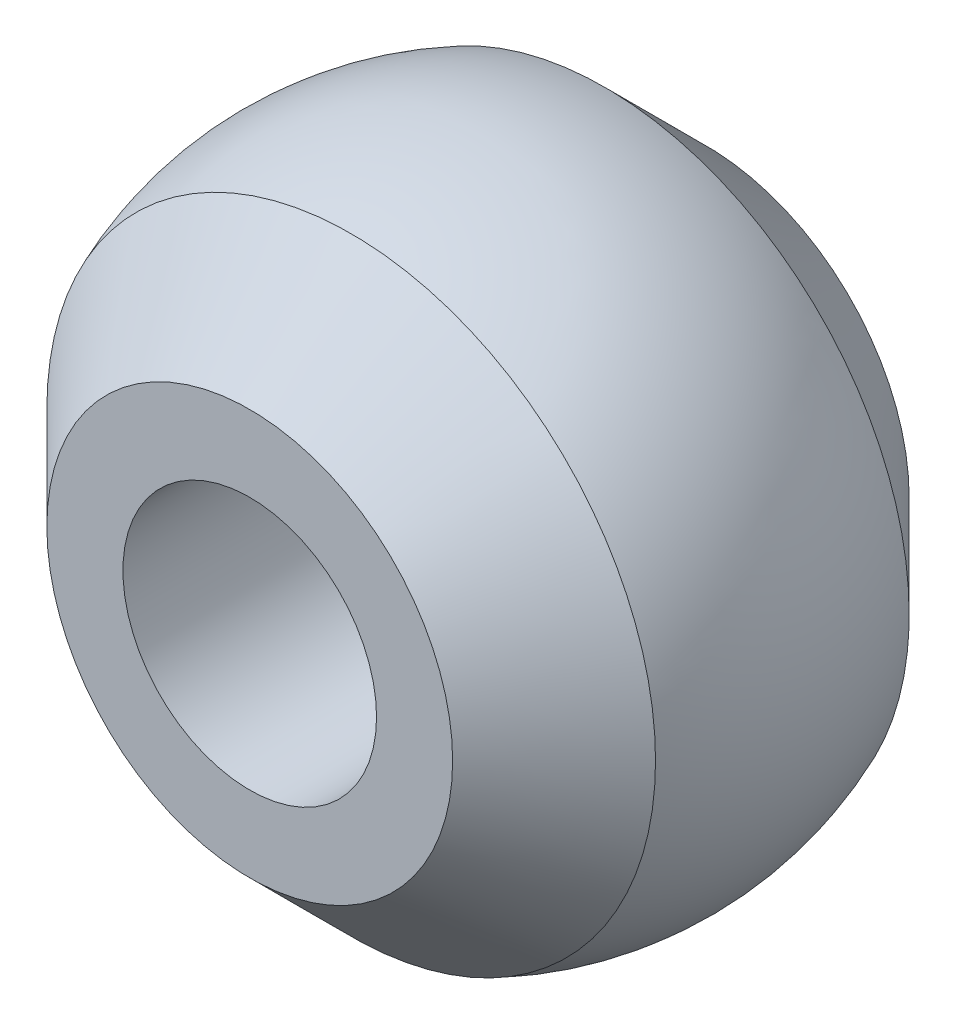
ISO-10303-21;
HEADER;
FILE_DESCRIPTION(('STEP AP214'),'2;1');
FILE_NAME('part.step','',(''),(''),'','','');
FILE_SCHEMA(('AUTOMOTIVE_DESIGN { 1 0 10303 214 1 1 1 1 }'));
ENDSEC;
DATA;
#1=APPLICATION_CONTEXT('core data for automotive mechanical design processes');
#2=APPLICATION_PROTOCOL_DEFINITION('international standard','automotive_design',2000,#1);
#3=PRODUCT_CONTEXT('',#1,'mechanical');
#4=PRODUCT('Part','Part','',(#3));
#5=PRODUCT_RELATED_PRODUCT_CATEGORY('part','',(#4));
#6=PRODUCT_DEFINITION_FORMATION('','',#4);
#7=PRODUCT_DEFINITION_CONTEXT('part definition',#1,'design');
#8=PRODUCT_DEFINITION('design','',#6,#7);
#9=PRODUCT_DEFINITION_SHAPE('','',#8);
#10=(LENGTH_UNIT() NAMED_UNIT(*) SI_UNIT(.MILLI.,.METRE.));
#11=(NAMED_UNIT(*) PLANE_ANGLE_UNIT() SI_UNIT($,.RADIAN.));
#12=(NAMED_UNIT(*) SI_UNIT($,.STERADIAN.) SOLID_ANGLE_UNIT());
#13=UNCERTAINTY_MEASURE_WITH_UNIT(LENGTH_MEASURE(1.E-05),#10,'distance_accuracy_value','');
#14=(GEOMETRIC_REPRESENTATION_CONTEXT(3) GLOBAL_UNCERTAINTY_ASSIGNED_CONTEXT((#13)) GLOBAL_UNIT_ASSIGNED_CONTEXT((#10,
#11,#12)) REPRESENTATION_CONTEXT('',''));
#15=CARTESIAN_POINT('',(0.,0.,0.));
#16=DIRECTION('',(0.,0.,1.));
#17=DIRECTION('',(1.,0.,0.));
#18=AXIS2_PLACEMENT_3D('',#15,#16,#17);
#19=CARTESIAN_POINT('',(0.,14.5,4.5));
#20=DIRECTION('',(0.,0.,1.));
#21=DIRECTION('',(1.,0.,0.));
#22=AXIS2_PLACEMENT_3D('',#19,#20,#21);
#23=PLANE('',#22);
#24=CARTESIAN_POINT('',(0.,14.5,4.5));
#25=DIRECTION('',(0.,0.,1.));
#26=DIRECTION('',(1.,0.,0.));
#27=AXIS2_PLACEMENT_3D('',#24,#25,#26);
#28=CIRCLE('',#27,2.5);
#29=CARTESIAN_POINT('',(2.5,14.5,4.5));
#30=VERTEX_POINT('',#29);
#31=EDGE_CURVE('E70',#30,#30,#28,.T.);
#32=ORIENTED_EDGE('',*,*,#31,.F.);
#33=EDGE_LOOP('',(#32));
#34=FACE_BOUND('',#33,.T.);
#35=CARTESIAN_POINT('',(0.,14.5,4.5));
#36=DIRECTION('',(0.,0.,1.));
#37=DIRECTION('',(1.,0.,0.));
#38=AXIS2_PLACEMENT_3D('',#35,#36,#37);
#39=CIRCLE('',#38,4.);
#40=CARTESIAN_POINT('',(4.,14.5,4.5));
#41=VERTEX_POINT('',#40);
#42=EDGE_CURVE('E11',#41,#41,#39,.T.);
#43=ORIENTED_EDGE('',*,*,#42,.T.);
#44=EDGE_LOOP('',(#43));
#45=FACE_BOUND('',#44,.T.);
#46=ADVANCED_FACE('F45',(#34,#45),#23,.T.);
#47=CARTESIAN_POINT('',(0.,14.5,4.5));
#48=DIRECTION('',(0.,0.,-1.));
#49=DIRECTION('',(-1.,0.,0.));
#50=AXIS2_PLACEMENT_3D('',#47,#48,#49);
#51=CONICAL_SURFACE('',#50,4.,0.785398163397448);
#52=ORIENTED_EDGE('',*,*,#42,.F.);
#53=EDGE_LOOP('',(#52));
#54=FACE_BOUND('',#53,.T.);
#55=CARTESIAN_POINT('',(0.,14.5,2.5));
#56=DIRECTION('',(0.,0.,1.));
#57=DIRECTION('',(1.,0.,0.));
#58=AXIS2_PLACEMENT_3D('',#55,#56,#57);
#59=CIRCLE('',#58,6.);
#60=CARTESIAN_POINT('',(6.,14.5,2.5));
#61=VERTEX_POINT('',#60);
#62=EDGE_CURVE('E78',#61,#61,#59,.T.);
#63=ORIENTED_EDGE('',*,*,#62,.T.);
#64=EDGE_LOOP('',(#63));
#65=FACE_BOUND('',#64,.T.);
#66=ADVANCED_FACE('F47',(#54,#65),#51,.T.);
#67=CARTESIAN_POINT('',(0.,14.5,-4.5));
#68=DIRECTION('',(0.,0.,-1.));
#69=DIRECTION('',(1.,0.,0.));
#70=AXIS2_PLACEMENT_3D('',#67,#68,#69);
#71=PLANE('',#70);
#72=CARTESIAN_POINT('',(0.,14.5,-4.5));
#73=DIRECTION('',(0.,0.,-1.));
#74=DIRECTION('',(-1.,0.,0.));
#75=AXIS2_PLACEMENT_3D('',#72,#73,#74);
#76=CIRCLE('',#75,2.5);
#77=CARTESIAN_POINT('',(-2.5,14.5,-4.5));
#78=VERTEX_POINT('',#77);
#79=EDGE_CURVE('E62',#78,#78,#76,.T.);
#80=ORIENTED_EDGE('',*,*,#79,.F.);
#81=EDGE_LOOP('',(#80));
#82=FACE_BOUND('',#81,.T.);
#83=CARTESIAN_POINT('',(0.,14.5,-4.5));
#84=DIRECTION('',(0.,0.,1.));
#85=DIRECTION('',(-1.,0.,0.));
#86=AXIS2_PLACEMENT_3D('',#83,#84,#85);
#87=CIRCLE('',#86,4.);
#88=CARTESIAN_POINT('',(-4.,14.5,-4.5));
#89=VERTEX_POINT('',#88);
#90=EDGE_CURVE('E56',#89,#89,#87,.T.);
#91=ORIENTED_EDGE('',*,*,#90,.F.);
#92=EDGE_LOOP('',(#91));
#93=FACE_BOUND('',#92,.T.);
#94=ADVANCED_FACE('F103',(#82,#93),#71,.T.);
#95=CARTESIAN_POINT('',(0.,14.5,-4.5));
#96=DIRECTION('',(0.,0.,1.));
#97=DIRECTION('',(-1.,0.,0.));
#98=AXIS2_PLACEMENT_3D('',#95,#96,#97);
#99=CONICAL_SURFACE('',#98,4.,0.785398163397448);
#100=ORIENTED_EDGE('',*,*,#90,.T.);
#101=EDGE_LOOP('',(#100));
#102=FACE_BOUND('',#101,.T.);
#103=CARTESIAN_POINT('',(6.,14.5,-2.5));
#104=CARTESIAN_POINT('',(6.00000208253265,14.5981748695653,-2.5));
#105=CARTESIAN_POINT('',(5.99759050275092,14.6963495619276,-2.5));
#106=CARTESIAN_POINT('',(5.98795497171115,14.8924625300015,-2.5));
#107=CARTESIAN_POINT('',(5.98073102045312,14.9904008057131,-2.5));
#108=CARTESIAN_POINT('',(5.96148569961324,15.1858048782416,-2.5));
#109=CARTESIAN_POINT('',(5.94946433003139,15.2832706750584,-2.5));
#110=CARTESIAN_POINT('',(5.92065378954598,15.4774950184059,-2.5));
#111=CARTESIAN_POINT('',(5.90386461864243,15.5742535649366,-2.5));
#112=CARTESIAN_POINT('',(5.86555874619633,15.7668302992569,-2.5));
#113=CARTESIAN_POINT('',(5.84404204465378,15.8626484870464,-2.5));
#114=CARTESIAN_POINT('',(5.79633299368075,16.0531136717927,-2.5));
#115=CARTESIAN_POINT('',(5.77014064425027,16.1477606687495,-2.5));
#116=CARTESIAN_POINT('',(5.71314338453624,16.3356554583041,-2.5));
#117=CARTESIAN_POINT('',(5.68233847425269,16.4289032509019,-2.5));
#118=CARTESIAN_POINT('',(5.61619030794355,16.6137749898048,-2.5));
#119=CARTESIAN_POINT('',(5.58084705191796,16.70539893611,-2.5));
#120=CARTESIAN_POINT('',(5.50570733821748,16.8868022522711,-2.5));
#121=CARTESIAN_POINT('',(5.46591088054258,16.9765816221271,-2.5));
#122=CARTESIAN_POINT('',(5.38196063693874,17.1540794990362,-2.5));
#123=CARTESIAN_POINT('',(5.33780685100979,17.2417980060893,-2.5));
#124=CARTESIAN_POINT('',(5.24524832117047,17.4149628358226,-2.5));
#125=CARTESIAN_POINT('',(5.19684357726009,17.5004091585029,-2.5));
#126=CARTESIAN_POINT('',(5.09589974274318,17.6688237718158,-2.5));
#127=CARTESIAN_POINT('',(5.04336065213664,17.7517920624485,-2.5));
#128=CARTESIAN_POINT('',(4.9342746954939,17.9150507337868,-2.5));
#129=CARTESIAN_POINT('',(4.87772782945769,17.9953411144924,-2.5));
#130=CARTESIAN_POINT('',(4.76076254831005,18.1530505394168,-2.5));
#131=CARTESIAN_POINT('',(4.70034413319862,18.2304695836357,-2.5));
#132=CARTESIAN_POINT('',(4.57578130715423,18.382249826328,-2.5));
#133=CARTESIAN_POINT('',(4.51163689622127,18.4566110248015,-2.5));
#134=CARTESIAN_POINT('',(4.37977660803824,18.6020964333627,-2.5));
#135=CARTESIAN_POINT('',(4.31206073078817,18.6732206434504,-2.5));
#136=CARTESIAN_POINT('',(4.1732206434504,18.8120607307882,-2.5));
#137=CARTESIAN_POINT('',(4.1020964333627,18.8797766080382,-2.5));
#138=CARTESIAN_POINT('',(3.95661102480152,19.0116368962213,-2.5));
#139=CARTESIAN_POINT('',(3.88224982632805,19.0757813071542,-2.5));
#140=CARTESIAN_POINT('',(3.7304695836357,19.2003441331986,-2.5));
#141=CARTESIAN_POINT('',(3.65305053941684,19.2607625483101,-2.5));
#142=CARTESIAN_POINT('',(3.49534111449236,19.3777278294576,-2.5));
#143=CARTESIAN_POINT('',(3.41505073378674,19.4342746954936,-2.5));
#144=CARTESIAN_POINT('',(3.25179206244848,19.5433606521369,-2.5));
#145=CARTESIAN_POINT('',(3.16882377181584,19.5958997427442,-2.5));
#146=CARTESIAN_POINT('',(3.00040915850282,19.696843577259,-2.5));
#147=CARTESIAN_POINT('',(2.91496283582245,19.7452483211665,-2.5));
#148=CARTESIAN_POINT('',(2.74179800608953,19.8378068510138,-2.5));
#149=CARTESIAN_POINT('',(2.65407949903697,19.8819606369536,-2.5));
#150=CARTESIAN_POINT('',(2.47658162212642,19.9659108805278,-2.5));
#151=CARTESIAN_POINT('',(2.38680225226841,20.0057073381621,-2.5));
#152=CARTESIAN_POINT('',(2.20539893611267,20.0808470519733,-2.5));
#153=CARTESIAN_POINT('',(2.11377498981494,20.1161903081501,-2.5));
#154=CARTESIAN_POINT('',(1.9289032508917,20.1823384740462,-2.5));
#155=CARTESIAN_POINT('',(1.83565545826619,20.2131433837655,-2.5));
#156=CARTESIAN_POINT('',(1.64776066878736,20.270140645021,-2.5));
#157=CARTESIAN_POINT('',(1.55311367193405,20.2963329965572,-2.5));
#158=CARTESIAN_POINT('',(1.36264848690513,20.3440420417773,-2.5));
#159=CARTESIAN_POINT('',(1.26683029872952,20.3655587354613,-2.5));
#160=CARTESIAN_POINT('',(1.07425356546402,20.4038646293774,-2.5));
#161=CARTESIAN_POINT('',(0.977495020374126,20.4206538296095,-2.5));
#162=CARTESIAN_POINT('',(0.783270673090214,20.4494642899679,-2.5));
#163=CARTESIAN_POINT('',(0.685804870896198,20.4614855500941,-2.5));
#164=CARTESIAN_POINT('',(0.490400813058528,20.4807311699722,-2.5));
#165=CARTESIAN_POINT('',(0.392462557414872,20.4879555297241,-2.5));
#166=CARTESIAN_POINT('',(0.196349534514145,20.497589944738,-2.5));
#167=CARTESIAN_POINT('',(0.0981747672570732,20.5,-2.5));
#168=CARTESIAN_POINT('',(-0.0981747672570702,20.5,-2.5));
#169=CARTESIAN_POINT('',(-0.196349534514142,20.497589944738,-2.5));
#170=CARTESIAN_POINT('',(-0.392462557414869,20.4879555297241,-2.5));
#171=CARTESIAN_POINT('',(-0.490400813058525,20.4807311699722,-2.5));
#172=CARTESIAN_POINT('',(-0.685804870896196,20.4614855500941,-2.5));
#173=CARTESIAN_POINT('',(-0.783270673090211,20.4494642899679,-2.5));
#174=CARTESIAN_POINT('',(-0.977495020374123,20.4206538296095,-2.5));
#175=CARTESIAN_POINT('',(-1.07425356546402,20.4038646293774,-2.5));
#176=CARTESIAN_POINT('',(-1.26683029872952,20.3655587354613,-2.5));
#177=CARTESIAN_POINT('',(-1.36264848690512,20.3440420417773,-2.5));
#178=CARTESIAN_POINT('',(-1.55311367193404,20.2963329965572,-2.5));
#179=CARTESIAN_POINT('',(-1.64776066878736,20.270140645021,-2.5));
#180=CARTESIAN_POINT('',(-1.83565545826619,20.2131433837655,-2.5));
#181=CARTESIAN_POINT('',(-1.9289032508917,20.1823384740462,-2.5));
#182=CARTESIAN_POINT('',(-2.11377498981494,20.1161903081501,-2.5));
#183=CARTESIAN_POINT('',(-2.20539893611267,20.0808470519733,-2.5));
#184=CARTESIAN_POINT('',(-2.38680225226841,20.0057073381621,-2.5));
#185=CARTESIAN_POINT('',(-2.47658162212641,19.9659108805278,-2.5));
#186=CARTESIAN_POINT('',(-2.65407949903697,19.8819606369536,-2.5));
#187=CARTESIAN_POINT('',(-2.74179800608952,19.8378068510138,-2.5));
#188=CARTESIAN_POINT('',(-2.91496283582245,19.7452483211665,-2.5));
#189=CARTESIAN_POINT('',(-3.00040915850282,19.696843577259,-2.5));
#190=CARTESIAN_POINT('',(-3.16882377181584,19.5958997427442,-2.5));
#191=CARTESIAN_POINT('',(-3.25179206244848,19.5433606521369,-2.5));
#192=CARTESIAN_POINT('',(-3.41505073378674,19.4342746954936,-2.5));
#193=CARTESIAN_POINT('',(-3.49534111449236,19.3777278294576,-2.5));
#194=CARTESIAN_POINT('',(-3.65305053941684,19.2607625483101,-2.5));
#195=CARTESIAN_POINT('',(-3.7304695836357,19.2003441331986,-2.5));
#196=CARTESIAN_POINT('',(-3.88224982632804,19.0757813071542,-2.5));
#197=CARTESIAN_POINT('',(-3.95661102480152,19.0116368962213,-2.5));
#198=CARTESIAN_POINT('',(-4.1020964333627,18.8797766080382,-2.5));
#199=CARTESIAN_POINT('',(-4.1732206434504,18.8120607307882,-2.5));
#200=CARTESIAN_POINT('',(-4.31206073078817,18.6732206434504,-2.5));
#201=CARTESIAN_POINT('',(-4.37977660803825,18.6020964333627,-2.5));
#202=CARTESIAN_POINT('',(-4.51163689622126,18.4566110248015,-2.5));
#203=CARTESIAN_POINT('',(-4.57578130715421,18.382249826328,-2.5));
#204=CARTESIAN_POINT('',(-4.70034413319864,18.2304695836357,-2.5));
#205=CARTESIAN_POINT('',(-4.76076254831013,18.1530505394168,-2.5));
#206=CARTESIAN_POINT('',(-4.87772782945761,17.9953411144924,-2.5));
#207=CARTESIAN_POINT('',(-4.93427469549361,17.9150507337867,-2.5));
#208=CARTESIAN_POINT('',(-5.04336065213693,17.7517920624485,-2.5));
#209=CARTESIAN_POINT('',(-5.09589974274424,17.6688237718158,-2.5));
#210=CARTESIAN_POINT('',(-5.19684357725902,17.5004091585028,-2.5));
#211=CARTESIAN_POINT('',(-5.24524832116649,17.4149628358225,-2.5));
#212=CARTESIAN_POINT('',(-5.33780685101377,17.2417980060895,-2.5));
#213=CARTESIAN_POINT('',(-5.38196063695357,17.154079499037,-2.5));
#214=CARTESIAN_POINT('',(-5.46591088052775,16.9765816221264,-2.5));
#215=CARTESIAN_POINT('',(-5.50570733816214,16.8868022522684,-2.5));
#216=CARTESIAN_POINT('',(-5.5808470519733,16.7053989361127,-2.5));
#217=CARTESIAN_POINT('',(-5.61619030815007,16.6137749898149,-2.5));
#218=CARTESIAN_POINT('',(-5.68233847404617,16.4289032508917,-2.5));
#219=CARTESIAN_POINT('',(-5.7131433837655,16.3356554582662,-2.5));
#220=CARTESIAN_POINT('',(-5.770140645021,16.1477606687874,-2.5));
#221=CARTESIAN_POINT('',(-5.79633299655718,16.053113671934,-2.5));
#222=CARTESIAN_POINT('',(-5.84404204177735,15.8626484869051,-2.5));
#223=CARTESIAN_POINT('',(-5.86555873546134,15.7668302987295,-2.5));
#224=CARTESIAN_POINT('',(-5.90386462937742,15.574253565464,-2.5));
#225=CARTESIAN_POINT('',(-5.92065382960951,15.4774950203741,-2.5));
#226=CARTESIAN_POINT('',(-5.94946428996786,15.2832706730902,-2.5));
#227=CARTESIAN_POINT('',(-5.96148555009412,15.1858048708962,-2.5));
#228=CARTESIAN_POINT('',(-5.98073116997224,14.9904008130585,-2.5));
#229=CARTESIAN_POINT('',(-5.98795552972409,14.8924625574149,-2.5));
#230=CARTESIAN_POINT('',(-5.99758994473797,14.6963495345141,-2.5));
#231=CARTESIAN_POINT('',(-6.,14.5981747672571,-2.5));
#232=CARTESIAN_POINT('',(-6.,14.4018252327429,-2.5));
#233=CARTESIAN_POINT('',(-5.99758994473797,14.3036504654859,-2.5));
#234=CARTESIAN_POINT('',(-5.98795552972409,14.1075374425851,-2.5));
#235=CARTESIAN_POINT('',(-5.98073116997224,14.0095991869415,-2.5));
#236=CARTESIAN_POINT('',(-5.96148555009412,13.8141951291038,-2.5));
#237=CARTESIAN_POINT('',(-5.94946428996786,13.7167293269098,-2.5));
#238=CARTESIAN_POINT('',(-5.92065382960951,13.5225049796259,-2.5));
#239=CARTESIAN_POINT('',(-5.90386462937742,13.425746434536,-2.5));
#240=CARTESIAN_POINT('',(-5.86555873546134,13.2331697012705,-2.5));
#241=CARTESIAN_POINT('',(-5.84404204177735,13.1373515130949,-2.5));
#242=CARTESIAN_POINT('',(-5.79633299655718,12.946886328066,-2.5));
#243=CARTESIAN_POINT('',(-5.770140645021,12.8522393312126,-2.5));
#244=CARTESIAN_POINT('',(-5.7131433837655,12.6643445417338,-2.5));
#245=CARTESIAN_POINT('',(-5.68233847404617,12.5710967491083,-2.5));
#246=CARTESIAN_POINT('',(-5.61619030815007,12.3862250101851,-2.5));
#247=CARTESIAN_POINT('',(-5.5808470519733,12.2946010638873,-2.5));
#248=CARTESIAN_POINT('',(-5.50570733816214,12.1131977477316,-2.5));
#249=CARTESIAN_POINT('',(-5.46591088052776,12.0234183778736,-2.5));
#250=CARTESIAN_POINT('',(-5.38196063695357,11.845920500963,-2.5));
#251=CARTESIAN_POINT('',(-5.33780685101377,11.7582019939105,-2.5));
#252=CARTESIAN_POINT('',(-5.2452483211665,11.5850371641776,-2.5));
#253=CARTESIAN_POINT('',(-5.19684357725902,11.4995908414972,-2.5));
#254=CARTESIAN_POINT('',(-5.09589974274424,11.3311762281842,-2.5));
#255=CARTESIAN_POINT('',(-5.04336065213693,11.2482079375515,-2.5));
#256=CARTESIAN_POINT('',(-4.93427469549362,11.0849492662133,-2.5));
#257=CARTESIAN_POINT('',(-4.87772782945762,11.0046588855076,-2.5));
#258=CARTESIAN_POINT('',(-4.76076254831013,10.8469494605832,-2.5));
#259=CARTESIAN_POINT('',(-4.70034413319864,10.7695304163643,-2.5));
#260=CARTESIAN_POINT('',(-4.57578130715421,10.617750173672,-2.5));
#261=CARTESIAN_POINT('',(-4.51163689622127,10.5433889751985,-2.5));
#262=CARTESIAN_POINT('',(-4.37977660803825,10.3979035666373,-2.5));
#263=CARTESIAN_POINT('',(-4.31206073078818,10.3267793565496,-2.5));
#264=CARTESIAN_POINT('',(-4.1732206434504,10.1879392692118,-2.5));
#265=CARTESIAN_POINT('',(-4.1020964333627,10.1202233919618,-2.5));
#266=CARTESIAN_POINT('',(-3.95661102480152,9.98836310377874,-2.5));
#267=CARTESIAN_POINT('',(-3.88224982632804,9.92421869284579,-2.5));
#268=CARTESIAN_POINT('',(-3.7304695836357,9.79965586680136,-2.5));
#269=CARTESIAN_POINT('',(-3.65305053941684,9.73923745168987,-2.5));
#270=CARTESIAN_POINT('',(-3.49534111449236,9.62227217054239,-2.5));
#271=CARTESIAN_POINT('',(-3.41505073378674,9.56572530450639,-2.5));
#272=CARTESIAN_POINT('',(-3.25179206244848,9.45663934786307,-2.5));
#273=CARTESIAN_POINT('',(-3.16882377181584,9.40410025725576,-2.5));
#274=CARTESIAN_POINT('',(-3.00040915850282,9.30315642274098,-2.5));
#275=CARTESIAN_POINT('',(-2.91496283582245,9.25475167883351,-2.5));
#276=CARTESIAN_POINT('',(-2.74179800608953,9.16219314898624,-2.5));
#277=CARTESIAN_POINT('',(-2.65407949903697,9.11803936304644,-2.5));
#278=CARTESIAN_POINT('',(-2.47658162212642,9.03408911947225,-2.5));
#279=CARTESIAN_POINT('',(-2.38680225226841,8.99429266183786,-2.5));
#280=CARTESIAN_POINT('',(-2.20539893611268,8.9191529480267,-2.5));
#281=CARTESIAN_POINT('',(-2.11377498981495,8.88380969184993,-2.5));
#282=CARTESIAN_POINT('',(-1.9289032508917,8.81766152595383,-2.5));
#283=CARTESIAN_POINT('',(-1.83565545826619,8.7868566162345,-2.5));
#284=CARTESIAN_POINT('',(-1.64776066878736,8.729859354979,-2.5));
#285=CARTESIAN_POINT('',(-1.55311367193405,8.70366700344282,-2.5));
#286=CARTESIAN_POINT('',(-1.36264848690513,8.65595795822265,-2.5));
#287=CARTESIAN_POINT('',(-1.26683029872952,8.63444126453866,-2.5));
#288=CARTESIAN_POINT('',(-1.07425356546402,8.59613537062257,-2.5));
#289=CARTESIAN_POINT('',(-0.977495020374125,8.57934617039049,-2.5));
#290=CARTESIAN_POINT('',(-0.783270673090215,8.55053571003214,-2.5));
#291=CARTESIAN_POINT('',(-0.685804870896199,8.53851444990588,-2.5));
#292=CARTESIAN_POINT('',(-0.490400813058528,8.51926883002776,-2.5));
#293=CARTESIAN_POINT('',(-0.392462557414873,8.5120444702759,-2.5));
#294=CARTESIAN_POINT('',(-0.196349534514146,8.50241005526203,-2.5));
#295=CARTESIAN_POINT('',(-0.098174767257074,8.5,-2.5));
#296=CARTESIAN_POINT('',(0.0981747672570696,8.5,-2.5));
#297=CARTESIAN_POINT('',(0.196349534514141,8.50241005526203,-2.5));
#298=CARTESIAN_POINT('',(0.392462557414872,8.5120444702759,-2.5));
#299=CARTESIAN_POINT('',(0.490400813058531,8.51926883002776,-2.5));
#300=CARTESIAN_POINT('',(0.685804870896202,8.53851444990588,-2.5));
#301=CARTESIAN_POINT('',(0.783270673090214,8.55053571003214,-2.5));
#302=CARTESIAN_POINT('',(0.97749502037412,8.57934617039049,-2.5));
#303=CARTESIAN_POINT('',(1.07425356546401,8.59613537062258,-2.5));
#304=CARTESIAN_POINT('',(1.26683029872951,8.63444126453866,-2.5));
#305=CARTESIAN_POINT('',(1.36264848690512,8.65595795822265,-2.5));
#306=CARTESIAN_POINT('',(1.55311367193404,8.70366700344282,-2.5));
#307=CARTESIAN_POINT('',(1.64776066878735,8.72985935497899,-2.5));
#308=CARTESIAN_POINT('',(1.83565545826618,8.7868566162345,-2.5));
#309=CARTESIAN_POINT('',(1.9289032508917,8.81766152595382,-2.5));
#310=CARTESIAN_POINT('',(2.11377498981494,8.88380969184993,-2.5));
#311=CARTESIAN_POINT('',(2.20539893611267,8.9191529480267,-2.5));
#312=CARTESIAN_POINT('',(2.38680225226841,8.99429266183786,-2.5));
#313=CARTESIAN_POINT('',(2.47658162212641,9.03408911947225,-2.5));
#314=CARTESIAN_POINT('',(2.65407949903697,9.11803936304644,-2.5));
#315=CARTESIAN_POINT('',(2.74179800608952,9.16219314898624,-2.5));
#316=CARTESIAN_POINT('',(2.91496283582245,9.25475167883351,-2.5));
#317=CARTESIAN_POINT('',(3.00040915850282,9.30315642274097,-2.5));
#318=CARTESIAN_POINT('',(3.16882377181584,9.40410025725576,-2.5));
#319=CARTESIAN_POINT('',(3.25179206244848,9.45663934786307,-2.5));
#320=CARTESIAN_POINT('',(3.41505073378674,9.56572530450639,-2.5));
#321=CARTESIAN_POINT('',(3.49534111449236,9.62227217054239,-2.5));
#322=CARTESIAN_POINT('',(3.65305053941684,9.73923745168988,-2.5));
#323=CARTESIAN_POINT('',(3.73046958363571,9.79965586680137,-2.5));
#324=CARTESIAN_POINT('',(3.88224982632804,9.92421869284579,-2.5));
#325=CARTESIAN_POINT('',(3.95661102480152,9.98836310377873,-2.5));
#326=CARTESIAN_POINT('',(4.1020964333627,10.1202233919617,-2.5));
#327=CARTESIAN_POINT('',(4.17322064345039,10.1879392692118,-2.5));
#328=CARTESIAN_POINT('',(4.31206073078816,10.3267793565496,-2.5));
#329=CARTESIAN_POINT('',(4.37977660803823,10.3979035666373,-2.5));
#330=CARTESIAN_POINT('',(4.51163689622127,10.5433889751985,-2.5));
#331=CARTESIAN_POINT('',(4.57578130715423,10.617750173672,-2.5));
#332=CARTESIAN_POINT('',(4.70034413319862,10.7695304163643,-2.5));
#333=CARTESIAN_POINT('',(4.76076254831005,10.8469494605832,-2.5));
#334=CARTESIAN_POINT('',(4.87772782945769,11.0046588855076,-2.5));
#335=CARTESIAN_POINT('',(4.9342746954939,11.0849492662132,-2.5));
#336=CARTESIAN_POINT('',(5.04336065213664,11.2482079375515,-2.5));
#337=CARTESIAN_POINT('',(5.09589974274318,11.3311762281842,-2.5));
#338=CARTESIAN_POINT('',(5.19684357726009,11.4995908414971,-2.5));
#339=CARTESIAN_POINT('',(5.24524832117047,11.5850371641774,-2.5));
#340=CARTESIAN_POINT('',(5.33780685100979,11.7582019939107,-2.5));
#341=CARTESIAN_POINT('',(5.38196063693874,11.8459205009638,-2.5));
#342=CARTESIAN_POINT('',(5.46591088054258,12.0234183778729,-2.5));
#343=CARTESIAN_POINT('',(5.50570733821748,12.1131977477289,-2.5));
#344=CARTESIAN_POINT('',(5.58084705191797,12.2946010638901,-2.5));
#345=CARTESIAN_POINT('',(5.61619030794356,12.3862250101952,-2.5));
#346=CARTESIAN_POINT('',(5.68233847425269,12.5710967490982,-2.5));
#347=CARTESIAN_POINT('',(5.71314338453624,12.664344541696,-2.5));
#348=CARTESIAN_POINT('',(5.77014064425027,12.8522393312505,-2.5));
#349=CARTESIAN_POINT('',(5.79633299368075,12.9468863282073,-2.5));
#350=CARTESIAN_POINT('',(5.84404204465378,13.1373515129536,-2.5));
#351=CARTESIAN_POINT('',(5.86555874619633,13.2331697007431,-2.5));
#352=CARTESIAN_POINT('',(5.90386461864243,13.4257464350633,-2.5));
#353=CARTESIAN_POINT('',(5.92065378954598,13.5225049815941,-2.5));
#354=CARTESIAN_POINT('',(5.94946433003139,13.7167293249416,-2.5));
#355=CARTESIAN_POINT('',(5.96148569961324,13.8141951217584,-2.5));
#356=CARTESIAN_POINT('',(5.98073102045312,14.0095991942869,-2.5));
#357=CARTESIAN_POINT('',(5.98795497171115,14.1075374699985,-2.5));
#358=CARTESIAN_POINT('',(5.99759050275092,14.3036504380724,-2.5));
#359=CARTESIAN_POINT('',(6.00000208253265,14.4018251304347,-2.5));
#360=CARTESIAN_POINT('',(6.,14.5,-2.5));
#361=B_SPLINE_CURVE_WITH_KNOTS('',3,(#103,#104,#105,#106,#107,#108,#109,#110,#111,#112,#113,
#114,#115,#116,#117,#118,#119,#120,#121,#122,#123,#124,#125,#126,#127,#128,#129,#130,#131,#132,
#133,#134,#135,#136,#137,#138,#139,#140,#141,#142,#143,#144,#145,#146,#147,#148,#149,#150,#151,
#152,#153,#154,#155,#156,#157,#158,#159,#160,#161,#162,#163,#164,#165,#166,#167,#168,#169,#170,
#171,#172,#173,#174,#175,#176,#177,#178,#179,#180,#181,#182,#183,#184,#185,#186,#187,#188,#189,
#190,#191,#192,#193,#194,#195,#196,#197,#198,#199,#200,#201,#202,#203,#204,#205,#206,#207,#208,
#209,#210,#211,#212,#213,#214,#215,#216,#217,#218,#219,#220,#221,#222,#223,#224,#225,#226,#227,
#228,#229,#230,#231,#232,#233,#234,#235,#236,#237,#238,#239,#240,#241,#242,#243,#244,#245,#246,
#247,#248,#249,#250,#251,#252,#253,#254,#255,#256,#257,#258,#259,#260,#261,#262,#263,#264,#265,
#266,#267,#268,#269,#270,#271,#272,#273,#274,#275,#276,#277,#278,#279,#280,#281,#282,#283,#284,
#285,#286,#287,#288,#289,#290,#291,#292,#293,#294,#295,#296,#297,#298,#299,#300,#301,#302,#303,
#304,#305,#306,#307,#308,#309,#310,#311,#312,#313,#314,#315,#316,#317,#318,#319,#320,#321,#322,
#323,#324,#325,#326,#327,#328,#329,#330,#331,#332,#333,#334,#335,#336,#337,#338,#339,#340,#341,
#342,#343,#344,#345,#346,#347,#348,#349,#350,#351,#352,#353,#354,#355,#356,#357,#358,#359,#360),
.UNSPECIFIED.,.F.,.F.,(4,2,2,2,2,2,2,2,2,2,2,2,2,2,2,2,2,2,2,2,2,2,2,2,2,2,2,2,2,2,2,2,2,2,2,2,
2,2,2,2,2,2,2,2,2,2,2,2,2,2,2,2,2,2,2,2,2,2,2,2,2,2,2,2,2,2,2,2,2,2,2,2,2,2,2,2,2,2,2,2,2,2,2,2,
2,2,2,2,2,2,2,2,2,2,2,2,2,2,2,2,2,2,2,2,2,2,2,2,2,2,2,2,2,2,2,2,2,2,2,2,2,2,2,2,2,2,2,2,4),(0.,
0.294494742274946,0.588989484549899,0.88348422682484,1.17797896909979,1.47247371137474,
1.76696845364969,2.06146319592464,2.35595793819958,2.65045268047453,2.94494742274948,
3.23944216502442,3.53393690729937,3.82843164957432,4.12292639184926,4.41742113412421,
4.71191587639916,5.00641061867411,5.30090536094905,5.595400103224,5.88989484549895,
6.1843895877739,6.47888433004884,6.77337907232379,7.06787381459874,7.36236855687368,
7.65686329914864,7.95135804142358,8.24585278369853,8.54034752597348,8.83484226824843,
9.12933701052337,9.42383175279832,9.71832649507327,10.0128212373482,10.3073159796232,
10.6018107218981,10.8963054641731,11.190800206448,11.485294948723,11.7797896909979,
12.0742844332728,12.3687791755478,12.6632739178227,12.9577686600977,13.2522634023726,
13.5467581446476,13.8412528869225,14.1357476291975,14.4302423714724,14.7247371137474,
15.0192318560223,15.3137265982973,15.6082213405722,15.9027160828472,16.1972108251221,
16.491705567397,16.786200309672,17.0806950519469,17.3751897942219,17.6696845364968,
17.9641792787718,18.2586740210467,18.5531687633217,18.8476635055966,19.1421582478716,
19.4366529901465,19.7311477324215,20.0256424746964,20.3201372169714,20.6146319592463,
20.9091267015213,21.2036214437962,21.4981161860711,21.7926109283461,22.087105670621,
22.381600412896,22.6760951551709,22.9705898974459,23.2650846397208,23.5595793819958,
23.8540741242707,24.1485688665457,24.4430636088206,24.7375583510956,25.0320530933705,
25.3265478356455,25.6210425779204,25.9155373201954,26.2100320624703,26.5045268047453,
26.7990215470202,27.0935162892951,27.3880110315701,27.682505773845,27.97700051612,
28.2714952583949,28.5659900006699,28.8604847429448,29.1549794852198,29.4494742274947,
29.7439689697697,30.0384637120446,30.3329584543196,30.6274531965945,30.9219479388695,
31.2164426811444,31.5109374234193,31.8054321656943,32.0999269079692,32.3944216502442,
32.6889163925191,32.9834111347941,33.277905877069,33.572400619344,33.8668953616189,
34.1613901038939,34.4558848461688,34.7503795884438,35.0448743307187,35.3393690729937,
35.6338638152686,35.9283585575436,36.2228532998185,36.5173480420935,36.8118427843684,
37.1063375266434,37.4008322689183,37.6953270111933),.UNSPECIFIED.);
#362=CARTESIAN_POINT('',(6.,14.5,-2.5));
#363=VERTEX_POINT('',#362);
#364=EDGE_CURVE('E74',#363,#363,#361,.T.);
#365=ORIENTED_EDGE('',*,*,#364,.F.);
#366=EDGE_LOOP('',(#365));
#367=FACE_BOUND('',#366,.T.);
#368=ADVANCED_FACE('F93',(#102,#367),#99,.T.);
#369=CARTESIAN_POINT('',(0.,14.5,-5.5));
#370=DIRECTION('',(0.,0.,1.));
#371=DIRECTION('',(1.,0.,0.));
#372=AXIS2_PLACEMENT_3D('',#369,#370,#371);
#373=CYLINDRICAL_SURFACE('',#372,2.5);
#374=ORIENTED_EDGE('',*,*,#79,.T.);
#375=EDGE_LOOP('',(#374));
#376=FACE_BOUND('',#375,.T.);
#377=ORIENTED_EDGE('',*,*,#31,.T.);
#378=EDGE_LOOP('',(#377));
#379=FACE_BOUND('',#378,.T.);
#380=ADVANCED_FACE('F102',(#376,#379),#373,.F.);
#381=CARTESIAN_POINT('',(0.,14.5,0.));
#382=DIRECTION('',(0.,0.,1.));
#383=DIRECTION('',(0.,1.,0.));
#384=AXIS2_PLACEMENT_3D('',#381,#382,#383);
#385=SPHERICAL_SURFACE('',#384,6.5);
#386=ORIENTED_EDGE('',*,*,#62,.F.);
#387=EDGE_LOOP('',(#386));
#388=FACE_BOUND('',#387,.T.);
#389=ORIENTED_EDGE('',*,*,#364,.T.);
#390=EDGE_LOOP('',(#389));
#391=FACE_BOUND('',#390,.T.);
#392=ADVANCED_FACE('F75',(#388,#391),#385,.T.);
#393=CLOSED_SHELL('',(#46,#66,#94,#368,#380,#392));
#394=MANIFOLD_SOLID_BREP('B2',#393);
#395=ADVANCED_BREP_SHAPE_REPRESENTATION('',(#18,#394),#14);
#396=SHAPE_DEFINITION_REPRESENTATION(#9,#395);
ENDSEC;
END-ISO-10303-21;
